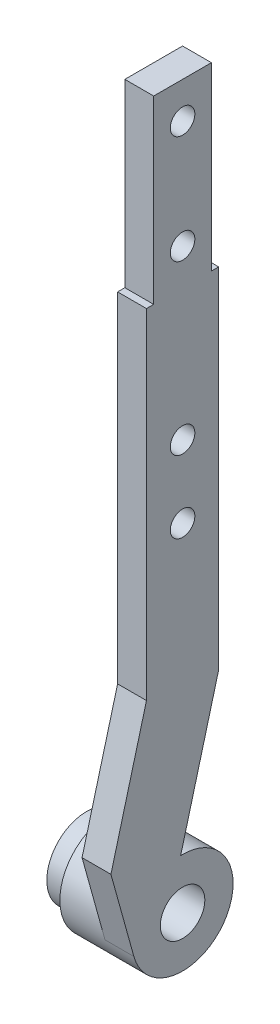
ISO-10303-21;
HEADER;
FILE_DESCRIPTION(('STEP AP214'),'2;1');
FILE_NAME('part.step','',(''),(''),'','','');
FILE_SCHEMA(('AUTOMOTIVE_DESIGN { 1 0 10303 214 1 1 1 1 }'));
ENDSEC;
DATA;
#1=APPLICATION_CONTEXT('core data for automotive mechanical design processes');
#2=APPLICATION_PROTOCOL_DEFINITION('international standard','automotive_design',2000,#1);
#3=PRODUCT_CONTEXT('',#1,'mechanical');
#4=PRODUCT('Part','Part','',(#3));
#5=PRODUCT_RELATED_PRODUCT_CATEGORY('part','',(#4));
#6=PRODUCT_DEFINITION_FORMATION('','',#4);
#7=PRODUCT_DEFINITION_CONTEXT('part definition',#1,'design');
#8=PRODUCT_DEFINITION('design','',#6,#7);
#9=PRODUCT_DEFINITION_SHAPE('','',#8);
#10=(LENGTH_UNIT() NAMED_UNIT(*) SI_UNIT(.MILLI.,.METRE.));
#11=(NAMED_UNIT(*) PLANE_ANGLE_UNIT() SI_UNIT($,.RADIAN.));
#12=(NAMED_UNIT(*) SI_UNIT($,.STERADIAN.) SOLID_ANGLE_UNIT());
#13=UNCERTAINTY_MEASURE_WITH_UNIT(LENGTH_MEASURE(1.E-05),#10,'distance_accuracy_value','');
#14=(GEOMETRIC_REPRESENTATION_CONTEXT(3) GLOBAL_UNCERTAINTY_ASSIGNED_CONTEXT((#13)) GLOBAL_UNIT_ASSIGNED_CONTEXT((#10,
#11,#12)) REPRESENTATION_CONTEXT('',''));
#15=CARTESIAN_POINT('',(0.,0.,0.));
#16=DIRECTION('',(0.,0.,1.));
#17=DIRECTION('',(1.,0.,0.));
#18=AXIS2_PLACEMENT_3D('',#15,#16,#17);
#19=CARTESIAN_POINT('',(-30.145,0.,0.));
#20=DIRECTION('',(1.,0.,0.));
#21=DIRECTION('',(0.,0.,1.));
#22=AXIS2_PLACEMENT_3D('',#19,#20,#21);
#23=CYLINDRICAL_SURFACE('',#22,7.);
#24=CARTESIAN_POINT('',(-30.145,0.,0.));
#25=DIRECTION('',(1.,0.,0.));
#26=DIRECTION('',(0.,0.,-1.));
#27=AXIS2_PLACEMENT_3D('',#24,#25,#26);
#28=CIRCLE('',#27,7.);
#29=CARTESIAN_POINT('',(-30.145,0.,-7.));
#30=VERTEX_POINT('',#29);
#31=EDGE_CURVE('E49',#30,#30,#28,.T.);
#32=ORIENTED_EDGE('',*,*,#31,.T.);
#33=EDGE_LOOP('',(#32));
#34=FACE_BOUND('',#33,.T.);
#35=DIRECTION('',(1.,0.,0.));
#36=VECTOR('',#35,1.);
#37=CARTESIAN_POINT('',(-24.145,6.99491771434268,0.266694899791794));
#38=LINE('',#37,#36);
#39=CARTESIAN_POINT('',(-24.145,6.99491771434268,0.266694899791794));
#40=VERTEX_POINT('',#39);
#41=CARTESIAN_POINT('',(-20.145,6.99491771434268,0.266694899791793));
#42=VERTEX_POINT('',#41);
#43=EDGE_CURVE('E139',#40,#42,#38,.T.);
#44=ORIENTED_EDGE('',*,*,#43,.T.);
#45=CARTESIAN_POINT('',(-20.145,0.,0.));
#46=DIRECTION('',(1.,0.,0.));
#47=DIRECTION('',(0.,0.,-1.));
#48=AXIS2_PLACEMENT_3D('',#45,#46,#47);
#49=CIRCLE('',#48,7.);
#50=CARTESIAN_POINT('',(-20.145,-1.87292477240286,6.74478708314204));
#51=VERTEX_POINT('',#50);
#52=EDGE_CURVE('E231',#51,#42,#49,.T.);
#53=ORIENTED_EDGE('',*,*,#52,.F.);
#54=DIRECTION('',(1.,0.,0.));
#55=VECTOR('',#54,1.);
#56=CARTESIAN_POINT('',(-24.145,-1.87292477240286,6.74478708314204));
#57=LINE('',#56,#55);
#58=CARTESIAN_POINT('',(-24.145,-1.87292477240286,6.74478708314204));
#59=VERTEX_POINT('',#58);
#60=EDGE_CURVE('E175',#59,#51,#57,.T.);
#61=ORIENTED_EDGE('',*,*,#60,.F.);
#62=CARTESIAN_POINT('',(-24.145,0.,0.));
#63=DIRECTION('',(1.,0.,0.));
#64=DIRECTION('',(0.,0.,-1.));
#65=AXIS2_PLACEMENT_3D('',#62,#63,#64);
#66=CIRCLE('',#65,7.);
#67=EDGE_CURVE('E145',#40,#59,#66,.T.);
#68=ORIENTED_EDGE('',*,*,#67,.F.);
#69=EDGE_LOOP('',(#44,#53,#61,#68));
#70=FACE_BOUND('',#69,.T.);
#71=ADVANCED_FACE('F41',(#34,#70),#23,.T.);
#72=CARTESIAN_POINT('',(-30.145,0.,0.));
#73=DIRECTION('',(1.,0.,0.));
#74=DIRECTION('',(0.,0.,1.));
#75=AXIS2_PLACEMENT_3D('',#72,#73,#74);
#76=CYLINDRICAL_SURFACE('',#75,3.0845);
#77=CARTESIAN_POINT('',(-20.145,0.,0.));
#78=DIRECTION('',(1.,0.,0.));
#79=DIRECTION('',(0.,0.,-1.));
#80=AXIS2_PLACEMENT_3D('',#77,#78,#79);
#81=CIRCLE('',#80,3.0845);
#82=CARTESIAN_POINT('',(-20.145,0.,-3.0845));
#83=VERTEX_POINT('',#82);
#84=EDGE_CURVE('E228',#83,#83,#81,.T.);
#85=ORIENTED_EDGE('',*,*,#84,.T.);
#86=EDGE_LOOP('',(#85));
#87=FACE_BOUND('',#86,.T.);
#88=CARTESIAN_POINT('',(-27.145,0.,0.));
#89=DIRECTION('',(1.,0.,0.));
#90=DIRECTION('',(0.,0.,-1.));
#91=AXIS2_PLACEMENT_3D('',#88,#89,#90);
#92=CIRCLE('',#91,3.0845);
#93=CARTESIAN_POINT('',(-27.145,0.,-3.0845));
#94=VERTEX_POINT('',#93);
#95=EDGE_CURVE('E225',#94,#94,#92,.T.);
#96=ORIENTED_EDGE('',*,*,#95,.F.);
#97=EDGE_LOOP('',(#96));
#98=FACE_BOUND('',#97,.T.);
#99=ADVANCED_FACE('F43',(#87,#98),#76,.F.);
#100=CARTESIAN_POINT('',(-30.145,0.,0.));
#101=DIRECTION('',(-1.,0.,0.));
#102=DIRECTION('',(0.,0.,-1.));
#103=AXIS2_PLACEMENT_3D('',#100,#101,#102);
#104=PLANE('',#103);
#105=CARTESIAN_POINT('',(-30.145,0.,0.));
#106=DIRECTION('',(1.,0.,0.));
#107=DIRECTION('',(0.,0.,-1.));
#108=AXIS2_PLACEMENT_3D('',#105,#106,#107);
#109=CIRCLE('',#108,5.49999999999996);
#110=CARTESIAN_POINT('',(-30.145,0.,-5.49999999999996));
#111=VERTEX_POINT('',#110);
#112=EDGE_CURVE('E548',#111,#111,#109,.T.);
#113=ORIENTED_EDGE('',*,*,#112,.T.);
#114=EDGE_LOOP('',(#113));
#115=FACE_BOUND('',#114,.T.);
#116=ORIENTED_EDGE('',*,*,#31,.F.);
#117=EDGE_LOOP('',(#116));
#118=FACE_BOUND('',#117,.T.);
#119=ADVANCED_FACE('F284',(#115,#118),#104,.T.);
#120=CARTESIAN_POINT('',(-20.145,0.,0.));
#121=DIRECTION('',(-1.,0.,0.));
#122=DIRECTION('',(0.,0.,-1.));
#123=AXIS2_PLACEMENT_3D('',#120,#121,#122);
#124=PLANE('',#123);
#125=CARTESIAN_POINT('',(-20.145,56.7479660865774,0.));
#126=DIRECTION('',(-1.,0.,0.));
#127=DIRECTION('',(0.,0.,1.));
#128=AXIS2_PLACEMENT_3D('',#125,#126,#127);
#129=CIRCLE('',#128,1.7);
#130=CARTESIAN_POINT('',(-20.145,56.7479660865774,1.7));
#131=VERTEX_POINT('',#130);
#132=EDGE_CURVE('E544',#131,#131,#129,.T.);
#133=ORIENTED_EDGE('',*,*,#132,.T.);
#134=EDGE_LOOP('',(#133));
#135=FACE_BOUND('',#134,.T.);
#136=CARTESIAN_POINT('',(-20.145,46.7479660865774,0.));
#137=DIRECTION('',(-1.,0.,0.));
#138=DIRECTION('',(0.,0.,1.));
#139=AXIS2_PLACEMENT_3D('',#136,#137,#138);
#140=CIRCLE('',#139,1.7);
#141=CARTESIAN_POINT('',(-20.145,46.7479660865774,1.7));
#142=VERTEX_POINT('',#141);
#143=EDGE_CURVE('E553',#142,#142,#140,.T.);
#144=ORIENTED_EDGE('',*,*,#143,.T.);
#145=EDGE_LOOP('',(#144));
#146=FACE_BOUND('',#145,.T.);
#147=ORIENTED_EDGE('',*,*,#84,.F.);
#148=EDGE_LOOP('',(#147));
#149=FACE_BOUND('',#148,.T.);
#150=ORIENTED_EDGE('',*,*,#52,.T.);
#151=DIRECTION('',(0.,0.965925826289068,-0.258819045102521));
#152=VECTOR('',#151,1.);
#153=CARTESIAN_POINT('',(-20.145,0.53524436311802,1.99755915762129));
#154=LINE('',#153,#152);
#155=CARTESIAN_POINT('',(-20.145,26.6504906683294,-4.99999999999999));
#156=VERTEX_POINT('',#155);
#157=EDGE_CURVE('E176',#42,#156,#154,.T.);
#158=ORIENTED_EDGE('',*,*,#157,.T.);
#159=DIRECTION('',(0.,1.,0.));
#160=VECTOR('',#159,1.);
#161=CARTESIAN_POINT('',(-20.145,0.,-4.99999999999999));
#162=LINE('',#161,#160);
#163=CARTESIAN_POINT('',(-20.145,75.,-4.99999999999999));
#164=VERTEX_POINT('',#163);
#165=EDGE_CURVE('E136',#156,#164,#162,.T.);
#166=ORIENTED_EDGE('',*,*,#165,.T.);
#167=DIRECTION('',(0.,0.,1.));
#168=VECTOR('',#167,1.);
#169=CARTESIAN_POINT('',(-20.145,75.,0.));
#170=LINE('',#169,#168);
#171=CARTESIAN_POINT('',(-20.145,75.,-4.));
#172=VERTEX_POINT('',#171);
#173=EDGE_CURVE('E180',#164,#172,#170,.T.);
#174=ORIENTED_EDGE('',*,*,#173,.T.);
#175=DIRECTION('',(0.,1.,0.));
#176=VECTOR('',#175,1.);
#177=CARTESIAN_POINT('',(-20.145,0.,-4.));
#178=LINE('',#177,#176);
#179=CARTESIAN_POINT('',(-20.145,100.,-4.));
#180=VERTEX_POINT('',#179);
#181=EDGE_CURVE('E183',#172,#180,#178,.T.);
#182=ORIENTED_EDGE('',*,*,#181,.T.);
#183=DIRECTION('',(0.,0.,1.));
#184=VECTOR('',#183,1.);
#185=CARTESIAN_POINT('',(-20.145,100.,0.));
#186=LINE('',#185,#184);
#187=CARTESIAN_POINT('',(-20.145,100.,4.00000000000001));
#188=VERTEX_POINT('',#187);
#189=EDGE_CURVE('E186',#180,#188,#186,.T.);
#190=ORIENTED_EDGE('',*,*,#189,.T.);
#191=DIRECTION('',(0.,1.,0.));
#192=VECTOR('',#191,1.);
#193=CARTESIAN_POINT('',(-20.145,0.,4.00000000000001));
#194=LINE('',#193,#192);
#195=CARTESIAN_POINT('',(-20.145,75.,4.00000000000001));
#196=VERTEX_POINT('',#195);
#197=EDGE_CURVE('E189',#196,#188,#194,.T.);
#198=ORIENTED_EDGE('',*,*,#197,.F.);
#199=DIRECTION('',(0.,0.,-1.));
#200=VECTOR('',#199,1.);
#201=CARTESIAN_POINT('',(-20.145,75.,0.));
#202=LINE('',#201,#200);
#203=CARTESIAN_POINT('',(-20.145,75.,5.));
#204=VERTEX_POINT('',#203);
#205=EDGE_CURVE('E192',#204,#196,#202,.T.);
#206=ORIENTED_EDGE('',*,*,#205,.F.);
#207=DIRECTION('',(0.,-1.,0.));
#208=VECTOR('',#207,1.);
#209=CARTESIAN_POINT('',(-20.145,0.,5.));
#210=LINE('',#209,#208);
#211=CARTESIAN_POINT('',(-20.145,27.9670156442034,5.));
#212=VERTEX_POINT('',#211);
#213=EDGE_CURVE('E195',#204,#212,#210,.T.);
#214=ORIENTED_EDGE('',*,*,#213,.T.);
#215=DIRECTION('',(0.,-0.965925826289068,0.258819045102521));
#216=VECTOR('',#215,1.);
#217=CARTESIAN_POINT('',(-20.145,3.12343481414323,11.656817420512));
#218=LINE('',#217,#216);
#219=CARTESIAN_POINT('',(-20.145,9.5831081653679,9.92595316268247));
#220=VERTEX_POINT('',#219);
#221=EDGE_CURVE('E198',#212,#220,#218,.T.);
#222=ORIENTED_EDGE('',*,*,#221,.T.);
#223=DIRECTION('',(0.,-0.963541011877434,-0.267560681771837));
#224=VECTOR('',#223,1.);
#225=CARTESIAN_POINT('',(-20.145,-1.87292477240286,6.74478708314204));
#226=LINE('',#225,#224);
#227=EDGE_CURVE('E201',#220,#51,#226,.T.);
#228=ORIENTED_EDGE('',*,*,#227,.T.);
#229=EDGE_LOOP('',(#150,#158,#166,#174,#182,#190,#198,#206,#214,#222,#228));
#230=FACE_BOUND('',#229,.T.);
#231=CARTESIAN_POINT('',(-20.145,80.,0.));
#232=DIRECTION('',(1.,0.,0.));
#233=DIRECTION('',(0.,0.,-1.));
#234=AXIS2_PLACEMENT_3D('',#231,#232,#233);
#235=CIRCLE('',#234,1.70000000000001);
#236=CARTESIAN_POINT('',(-20.145,80.,-1.7));
#237=VERTEX_POINT('',#236);
#238=EDGE_CURVE('E203',#237,#237,#235,.T.);
#239=ORIENTED_EDGE('',*,*,#238,.F.);
#240=EDGE_LOOP('',(#239));
#241=FACE_BOUND('',#240,.T.);
#242=CARTESIAN_POINT('',(-20.145,95.,0.));
#243=DIRECTION('',(1.,0.,0.));
#244=DIRECTION('',(0.,0.,-1.));
#245=AXIS2_PLACEMENT_3D('',#242,#243,#244);
#246=CIRCLE('',#245,1.70000000000001);
#247=CARTESIAN_POINT('',(-20.145,95.,-1.7));
#248=VERTEX_POINT('',#247);
#249=EDGE_CURVE('E147',#248,#248,#246,.T.);
#250=ORIENTED_EDGE('',*,*,#249,.F.);
#251=EDGE_LOOP('',(#250));
#252=FACE_BOUND('',#251,.T.);
#253=ADVANCED_FACE('F236',(#135,#146,#149,#230,#241,#252),#124,.F.);
#254=CARTESIAN_POINT('',(-27.145,0.,0.));
#255=DIRECTION('',(-1.,0.,0.));
#256=DIRECTION('',(0.,0.,-1.));
#257=AXIS2_PLACEMENT_3D('',#254,#255,#256);
#258=PLANE('',#257);
#259=ORIENTED_EDGE('',*,*,#95,.T.);
#260=EDGE_LOOP('',(#259));
#261=FACE_BOUND('',#260,.T.);
#262=ADVANCED_FACE('F289',(#261),#258,.F.);
#263=CARTESIAN_POINT('',(-24.145,0.53524436311802,1.99755915762129));
#264=DIRECTION('',(0.,0.258819045102521,0.965925826289068));
#265=DIRECTION('',(0.,0.965925826289068,-0.258819045102521));
#266=AXIS2_PLACEMENT_3D('',#263,#264,#265);
#267=PLANE('',#266);
#268=ORIENTED_EDGE('',*,*,#157,.F.);
#269=ORIENTED_EDGE('',*,*,#43,.F.);
#270=DIRECTION('',(0.,0.965925826289068,-0.258819045102521));
#271=VECTOR('',#270,1.);
#272=CARTESIAN_POINT('',(-24.145,0.53524436311802,1.99755915762129));
#273=LINE('',#272,#271);
#274=CARTESIAN_POINT('',(-24.145,26.6504906683294,-4.99999999999999));
#275=VERTEX_POINT('',#274);
#276=EDGE_CURVE('E63',#40,#275,#273,.T.);
#277=ORIENTED_EDGE('',*,*,#276,.T.);
#278=DIRECTION('',(1.,0.,0.));
#279=VECTOR('',#278,1.);
#280=CARTESIAN_POINT('',(-24.145,26.6504906683294,-4.99999999999999));
#281=LINE('',#280,#279);
#282=EDGE_CURVE('E133',#275,#156,#281,.T.);
#283=ORIENTED_EDGE('',*,*,#282,.T.);
#284=EDGE_LOOP('',(#268,#269,#277,#283));
#285=FACE_BOUND('',#284,.T.);
#286=ADVANCED_FACE('F143',(#285),#267,.F.);
#287=CARTESIAN_POINT('',(-24.145,0.,-4.99999999999999));
#288=DIRECTION('',(0.,0.,1.));
#289=DIRECTION('',(-1.,0.,0.));
#290=AXIS2_PLACEMENT_3D('',#287,#288,#289);
#291=PLANE('',#290);
#292=ORIENTED_EDGE('',*,*,#165,.F.);
#293=ORIENTED_EDGE('',*,*,#282,.F.);
#294=DIRECTION('',(0.,1.,0.));
#295=VECTOR('',#294,1.);
#296=CARTESIAN_POINT('',(-24.145,0.,-4.99999999999999));
#297=LINE('',#296,#295);
#298=CARTESIAN_POINT('',(-24.145,75.,-4.99999999999999));
#299=VERTEX_POINT('',#298);
#300=EDGE_CURVE('E123',#275,#299,#297,.T.);
#301=ORIENTED_EDGE('',*,*,#300,.T.);
#302=DIRECTION('',(1.,0.,0.));
#303=VECTOR('',#302,1.);
#304=CARTESIAN_POINT('',(-24.145,75.,-4.99999999999999));
#305=LINE('',#304,#303);
#306=EDGE_CURVE('E140',#299,#164,#305,.T.);
#307=ORIENTED_EDGE('',*,*,#306,.T.);
#308=EDGE_LOOP('',(#292,#293,#301,#307));
#309=FACE_BOUND('',#308,.T.);
#310=ADVANCED_FACE('F134',(#309),#291,.F.);
#311=CARTESIAN_POINT('',(-24.145,75.,0.));
#312=DIRECTION('',(0.,-1.,0.));
#313=DIRECTION('',(1.,0.,0.));
#314=AXIS2_PLACEMENT_3D('',#311,#312,#313);
#315=PLANE('',#314);
#316=ORIENTED_EDGE('',*,*,#173,.F.);
#317=ORIENTED_EDGE('',*,*,#306,.F.);
#318=DIRECTION('',(0.,0.,1.));
#319=VECTOR('',#318,1.);
#320=CARTESIAN_POINT('',(-24.145,75.,0.));
#321=LINE('',#320,#319);
#322=CARTESIAN_POINT('',(-24.145,75.,-4.));
#323=VERTEX_POINT('',#322);
#324=EDGE_CURVE('E128',#299,#323,#321,.T.);
#325=ORIENTED_EDGE('',*,*,#324,.T.);
#326=DIRECTION('',(1.,0.,0.));
#327=VECTOR('',#326,1.);
#328=CARTESIAN_POINT('',(-24.145,75.,-4.));
#329=LINE('',#328,#327);
#330=EDGE_CURVE('E221',#323,#172,#329,.T.);
#331=ORIENTED_EDGE('',*,*,#330,.T.);
#332=EDGE_LOOP('',(#316,#317,#325,#331));
#333=FACE_BOUND('',#332,.T.);
#334=ADVANCED_FACE('F270',(#333),#315,.F.);
#335=CARTESIAN_POINT('',(-24.145,0.,-4.));
#336=DIRECTION('',(0.,0.,1.));
#337=DIRECTION('',(-1.,0.,0.));
#338=AXIS2_PLACEMENT_3D('',#335,#336,#337);
#339=PLANE('',#338);
#340=ORIENTED_EDGE('',*,*,#181,.F.);
#341=ORIENTED_EDGE('',*,*,#330,.F.);
#342=DIRECTION('',(0.,1.,0.));
#343=VECTOR('',#342,1.);
#344=CARTESIAN_POINT('',(-24.145,0.,-4.));
#345=LINE('',#344,#343);
#346=CARTESIAN_POINT('',(-24.145,100.,-4.));
#347=VERTEX_POINT('',#346);
#348=EDGE_CURVE('E152',#323,#347,#345,.T.);
#349=ORIENTED_EDGE('',*,*,#348,.T.);
#350=DIRECTION('',(1.,0.,0.));
#351=VECTOR('',#350,1.);
#352=CARTESIAN_POINT('',(-24.145,100.,-4.));
#353=LINE('',#352,#351);
#354=EDGE_CURVE('E219',#347,#180,#353,.T.);
#355=ORIENTED_EDGE('',*,*,#354,.T.);
#356=EDGE_LOOP('',(#340,#341,#349,#355));
#357=FACE_BOUND('',#356,.T.);
#358=ADVANCED_FACE('F267',(#357),#339,.F.);
#359=CARTESIAN_POINT('',(-24.145,100.,0.));
#360=DIRECTION('',(0.,-1.,0.));
#361=DIRECTION('',(1.,0.,0.));
#362=AXIS2_PLACEMENT_3D('',#359,#360,#361);
#363=PLANE('',#362);
#364=ORIENTED_EDGE('',*,*,#189,.F.);
#365=ORIENTED_EDGE('',*,*,#354,.F.);
#366=DIRECTION('',(0.,0.,1.));
#367=VECTOR('',#366,1.);
#368=CARTESIAN_POINT('',(-24.145,100.,0.));
#369=LINE('',#368,#367);
#370=CARTESIAN_POINT('',(-24.145,100.,4.00000000000001));
#371=VERTEX_POINT('',#370);
#372=EDGE_CURVE('E155',#347,#371,#369,.T.);
#373=ORIENTED_EDGE('',*,*,#372,.T.);
#374=DIRECTION('',(1.,0.,0.));
#375=VECTOR('',#374,1.);
#376=CARTESIAN_POINT('',(-24.145,100.,4.00000000000001));
#377=LINE('',#376,#375);
#378=EDGE_CURVE('E217',#371,#188,#377,.T.);
#379=ORIENTED_EDGE('',*,*,#378,.T.);
#380=EDGE_LOOP('',(#364,#365,#373,#379));
#381=FACE_BOUND('',#380,.T.);
#382=ADVANCED_FACE('F263',(#381),#363,.F.);
#383=CARTESIAN_POINT('',(-24.145,0.,4.00000000000001));
#384=DIRECTION('',(0.,0.,1.));
#385=DIRECTION('',(-1.,0.,0.));
#386=AXIS2_PLACEMENT_3D('',#383,#384,#385);
#387=PLANE('',#386);
#388=ORIENTED_EDGE('',*,*,#197,.T.);
#389=ORIENTED_EDGE('',*,*,#378,.F.);
#390=DIRECTION('',(0.,1.,0.));
#391=VECTOR('',#390,1.);
#392=CARTESIAN_POINT('',(-24.145,0.,4.00000000000001));
#393=LINE('',#392,#391);
#394=CARTESIAN_POINT('',(-24.145,75.,4.00000000000001));
#395=VERTEX_POINT('',#394);
#396=EDGE_CURVE('E158',#395,#371,#393,.T.);
#397=ORIENTED_EDGE('',*,*,#396,.F.);
#398=DIRECTION('',(1.,0.,0.));
#399=VECTOR('',#398,1.);
#400=CARTESIAN_POINT('',(-24.145,75.,4.00000000000001));
#401=LINE('',#400,#399);
#402=EDGE_CURVE('E215',#395,#196,#401,.T.);
#403=ORIENTED_EDGE('',*,*,#402,.T.);
#404=EDGE_LOOP('',(#388,#389,#397,#403));
#405=FACE_BOUND('',#404,.T.);
#406=ADVANCED_FACE('F259',(#405),#387,.T.);
#407=CARTESIAN_POINT('',(-24.145,75.,0.));
#408=DIRECTION('',(0.,1.,0.));
#409=DIRECTION('',(-1.,0.,0.));
#410=AXIS2_PLACEMENT_3D('',#407,#408,#409);
#411=PLANE('',#410);
#412=ORIENTED_EDGE('',*,*,#205,.T.);
#413=ORIENTED_EDGE('',*,*,#402,.F.);
#414=DIRECTION('',(0.,0.,-1.));
#415=VECTOR('',#414,1.);
#416=CARTESIAN_POINT('',(-24.145,75.,0.));
#417=LINE('',#416,#415);
#418=CARTESIAN_POINT('',(-24.145,75.,5.));
#419=VERTEX_POINT('',#418);
#420=EDGE_CURVE('E160',#419,#395,#417,.T.);
#421=ORIENTED_EDGE('',*,*,#420,.F.);
#422=DIRECTION('',(1.,0.,0.));
#423=VECTOR('',#422,1.);
#424=CARTESIAN_POINT('',(-24.145,75.,5.));
#425=LINE('',#424,#423);
#426=EDGE_CURVE('E213',#419,#204,#425,.T.);
#427=ORIENTED_EDGE('',*,*,#426,.T.);
#428=EDGE_LOOP('',(#412,#413,#421,#427));
#429=FACE_BOUND('',#428,.T.);
#430=ADVANCED_FACE('F255',(#429),#411,.T.);
#431=CARTESIAN_POINT('',(-24.145,0.,5.));
#432=DIRECTION('',(0.,0.,-1.));
#433=DIRECTION('',(1.,0.,0.));
#434=AXIS2_PLACEMENT_3D('',#431,#432,#433);
#435=PLANE('',#434);
#436=ORIENTED_EDGE('',*,*,#213,.F.);
#437=ORIENTED_EDGE('',*,*,#426,.F.);
#438=DIRECTION('',(0.,-1.,0.));
#439=VECTOR('',#438,1.);
#440=CARTESIAN_POINT('',(-24.145,0.,5.));
#441=LINE('',#440,#439);
#442=CARTESIAN_POINT('',(-24.145,27.9670156442034,5.));
#443=VERTEX_POINT('',#442);
#444=EDGE_CURVE('E162',#419,#443,#441,.T.);
#445=ORIENTED_EDGE('',*,*,#444,.T.);
#446=DIRECTION('',(1.,0.,0.));
#447=VECTOR('',#446,1.);
#448=CARTESIAN_POINT('',(-24.145,27.9670156442034,5.));
#449=LINE('',#448,#447);
#450=EDGE_CURVE('E211',#443,#212,#449,.T.);
#451=ORIENTED_EDGE('',*,*,#450,.T.);
#452=EDGE_LOOP('',(#436,#437,#445,#451));
#453=FACE_BOUND('',#452,.T.);
#454=ADVANCED_FACE('F249',(#453),#435,.F.);
#455=CARTESIAN_POINT('',(-24.145,3.12343481414323,11.656817420512));
#456=DIRECTION('',(0.,-0.258819045102521,-0.965925826289068));
#457=DIRECTION('',(0.,-0.965925826289068,0.258819045102521));
#458=AXIS2_PLACEMENT_3D('',#455,#456,#457);
#459=PLANE('',#458);
#460=ORIENTED_EDGE('',*,*,#221,.F.);
#461=ORIENTED_EDGE('',*,*,#450,.F.);
#462=DIRECTION('',(0.,-0.965925826289068,0.258819045102521));
#463=VECTOR('',#462,1.);
#464=CARTESIAN_POINT('',(-24.145,3.12343481414323,11.656817420512));
#465=LINE('',#464,#463);
#466=CARTESIAN_POINT('',(-24.145,9.5831081653679,9.92595316268247));
#467=VERTEX_POINT('',#466);
#468=EDGE_CURVE('E165',#443,#467,#465,.T.);
#469=ORIENTED_EDGE('',*,*,#468,.T.);
#470=DIRECTION('',(1.,0.,0.));
#471=VECTOR('',#470,1.);
#472=CARTESIAN_POINT('',(-24.145,9.5831081653679,9.92595316268247));
#473=LINE('',#472,#471);
#474=EDGE_CURVE('E209',#467,#220,#473,.T.);
#475=ORIENTED_EDGE('',*,*,#474,.T.);
#476=EDGE_LOOP('',(#460,#461,#469,#475));
#477=FACE_BOUND('',#476,.T.);
#478=ADVANCED_FACE('F245',(#477),#459,.F.);
#479=CARTESIAN_POINT('',(-24.145,80.,0.));
#480=DIRECTION('',(1.,0.,0.));
#481=DIRECTION('',(0.,0.,1.));
#482=AXIS2_PLACEMENT_3D('',#479,#480,#481);
#483=CYLINDRICAL_SURFACE('',#482,1.70000000000001);
#484=CARTESIAN_POINT('',(-24.145,80.,0.));
#485=DIRECTION('',(1.,0.,0.));
#486=DIRECTION('',(0.,0.,-1.));
#487=AXIS2_PLACEMENT_3D('',#484,#485,#486);
#488=CIRCLE('',#487,1.70000000000001);
#489=CARTESIAN_POINT('',(-24.145,80.,-1.7));
#490=VERTEX_POINT('',#489);
#491=EDGE_CURVE('E169',#490,#490,#488,.T.);
#492=ORIENTED_EDGE('',*,*,#491,.F.);
#493=EDGE_LOOP('',(#492));
#494=FACE_BOUND('',#493,.T.);
#495=ORIENTED_EDGE('',*,*,#238,.T.);
#496=EDGE_LOOP('',(#495));
#497=FACE_BOUND('',#496,.T.);
#498=ADVANCED_FACE('F365',(#494,#497),#483,.F.);
#499=CARTESIAN_POINT('',(-24.145,-1.87292477240286,6.74478708314204));
#500=DIRECTION('',(0.,0.267560681771837,-0.963541011877434));
#501=DIRECTION('',(0.,-0.963541011877434,-0.267560681771837));
#502=AXIS2_PLACEMENT_3D('',#499,#500,#501);
#503=PLANE('',#502);
#504=ORIENTED_EDGE('',*,*,#227,.F.);
#505=ORIENTED_EDGE('',*,*,#474,.F.);
#506=DIRECTION('',(0.,-0.963541011877434,-0.267560681771837));
#507=VECTOR('',#506,1.);
#508=CARTESIAN_POINT('',(-24.145,-1.87292477240286,6.74478708314204));
#509=LINE('',#508,#507);
#510=EDGE_CURVE('E56',#467,#59,#509,.T.);
#511=ORIENTED_EDGE('',*,*,#510,.T.);
#512=ORIENTED_EDGE('',*,*,#60,.T.);
#513=EDGE_LOOP('',(#504,#505,#511,#512));
#514=FACE_BOUND('',#513,.T.);
#515=ADVANCED_FACE('F242',(#514),#503,.F.);
#516=CARTESIAN_POINT('',(-24.145,95.,0.));
#517=DIRECTION('',(1.,0.,0.));
#518=DIRECTION('',(0.,0.,1.));
#519=AXIS2_PLACEMENT_3D('',#516,#517,#518);
#520=CYLINDRICAL_SURFACE('',#519,1.70000000000001);
#521=CARTESIAN_POINT('',(-24.145,95.,0.));
#522=DIRECTION('',(1.,0.,0.));
#523=DIRECTION('',(0.,0.,-1.));
#524=AXIS2_PLACEMENT_3D('',#521,#522,#523);
#525=CIRCLE('',#524,1.70000000000001);
#526=CARTESIAN_POINT('',(-24.145,95.,-1.7));
#527=VERTEX_POINT('',#526);
#528=EDGE_CURVE('E172',#527,#527,#525,.T.);
#529=ORIENTED_EDGE('',*,*,#528,.F.);
#530=EDGE_LOOP('',(#529));
#531=FACE_BOUND('',#530,.T.);
#532=ORIENTED_EDGE('',*,*,#249,.T.);
#533=EDGE_LOOP('',(#532));
#534=FACE_BOUND('',#533,.T.);
#535=ADVANCED_FACE('F385',(#531,#534),#520,.F.);
#536=CARTESIAN_POINT('',(-24.145,0.,0.));
#537=DIRECTION('',(-1.,0.,0.));
#538=DIRECTION('',(0.,0.,-1.));
#539=AXIS2_PLACEMENT_3D('',#536,#537,#538);
#540=PLANE('',#539);
#541=CARTESIAN_POINT('',(-24.145,56.7479660865774,0.));
#542=DIRECTION('',(1.,0.,0.));
#543=DIRECTION('',(0.,0.,-1.));
#544=AXIS2_PLACEMENT_3D('',#541,#542,#543);
#545=CIRCLE('',#544,1.7);
#546=CARTESIAN_POINT('',(-24.145,56.7479660865774,-1.7));
#547=VERTEX_POINT('',#546);
#548=EDGE_CURVE('E547',#547,#547,#545,.F.);
#549=ORIENTED_EDGE('',*,*,#548,.F.);
#550=EDGE_LOOP('',(#549));
#551=FACE_BOUND('',#550,.T.);
#552=CARTESIAN_POINT('',(-24.145,46.7479660865774,0.));
#553=DIRECTION('',(1.,0.,0.));
#554=DIRECTION('',(0.,0.,-1.));
#555=AXIS2_PLACEMENT_3D('',#552,#553,#554);
#556=CIRCLE('',#555,1.7);
#557=CARTESIAN_POINT('',(-24.145,46.7479660865774,-1.69999999999999));
#558=VERTEX_POINT('',#557);
#559=EDGE_CURVE('E556',#558,#558,#556,.F.);
#560=ORIENTED_EDGE('',*,*,#559,.F.);
#561=EDGE_LOOP('',(#560));
#562=FACE_BOUND('',#561,.T.);
#563=ORIENTED_EDGE('',*,*,#67,.T.);
#564=ORIENTED_EDGE('',*,*,#510,.F.);
#565=ORIENTED_EDGE('',*,*,#468,.F.);
#566=ORIENTED_EDGE('',*,*,#444,.F.);
#567=ORIENTED_EDGE('',*,*,#420,.T.);
#568=ORIENTED_EDGE('',*,*,#396,.T.);
#569=ORIENTED_EDGE('',*,*,#372,.F.);
#570=ORIENTED_EDGE('',*,*,#348,.F.);
#571=ORIENTED_EDGE('',*,*,#324,.F.);
#572=ORIENTED_EDGE('',*,*,#300,.F.);
#573=ORIENTED_EDGE('',*,*,#276,.F.);
#574=EDGE_LOOP('',(#563,#564,#565,#566,#567,#568,#569,#570,#571,#572,#573));
#575=FACE_BOUND('',#574,.T.);
#576=ORIENTED_EDGE('',*,*,#491,.T.);
#577=EDGE_LOOP('',(#576));
#578=FACE_BOUND('',#577,.T.);
#579=ORIENTED_EDGE('',*,*,#528,.T.);
#580=EDGE_LOOP('',(#579));
#581=FACE_BOUND('',#580,.T.);
#582=ADVANCED_FACE('F125',(#551,#562,#575,#578,#581),#540,.T.);
#583=CARTESIAN_POINT('',(-49.0063491861039,0.,0.));
#584=DIRECTION('',(1.,0.,0.));
#585=DIRECTION('',(0.,0.,1.));
#586=AXIS2_PLACEMENT_3D('',#583,#584,#585);
#587=CYLINDRICAL_SURFACE('',#586,5.49999999999996);
#588=ORIENTED_EDGE('',*,*,#112,.F.);
#589=EDGE_LOOP('',(#588));
#590=FACE_BOUND('',#589,.T.);
#591=CARTESIAN_POINT('',(-33.45,0.,0.));
#592=DIRECTION('',(1.,0.,0.));
#593=DIRECTION('',(0.,0.,-1.));
#594=AXIS2_PLACEMENT_3D('',#591,#592,#593);
#595=CIRCLE('',#594,5.49999999999996);
#596=CARTESIAN_POINT('',(-33.45,0.,-5.49999999999996));
#597=VERTEX_POINT('',#596);
#598=EDGE_CURVE('E178',#597,#597,#595,.T.);
#599=ORIENTED_EDGE('',*,*,#598,.T.);
#600=EDGE_LOOP('',(#599));
#601=FACE_BOUND('',#600,.T.);
#602=ADVANCED_FACE('F405',(#590,#601),#587,.T.);
#603=CARTESIAN_POINT('',(-49.0063491861039,0.,0.));
#604=DIRECTION('',(1.,0.,0.));
#605=DIRECTION('',(0.,0.,1.));
#606=AXIS2_PLACEMENT_3D('',#603,#604,#605);
#607=CYLINDRICAL_SURFACE('',#606,3.49999999999996);
#608=CARTESIAN_POINT('',(-30.145,0.,0.));
#609=DIRECTION('',(1.,0.,0.));
#610=DIRECTION('',(0.,0.,-1.));
#611=AXIS2_PLACEMENT_3D('',#608,#609,#610);
#612=CIRCLE('',#611,3.49999999999996);
#613=CARTESIAN_POINT('',(-30.145,0.,-3.49999999999996));
#614=VERTEX_POINT('',#613);
#615=EDGE_CURVE('E11',#614,#614,#612,.F.);
#616=ORIENTED_EDGE('',*,*,#615,.F.);
#617=EDGE_LOOP('',(#616));
#618=FACE_BOUND('',#617,.T.);
#619=CARTESIAN_POINT('',(-33.45,0.,0.));
#620=DIRECTION('',(1.,0.,0.));
#621=DIRECTION('',(0.,0.,-1.));
#622=AXIS2_PLACEMENT_3D('',#619,#620,#621);
#623=CIRCLE('',#622,3.49999999999996);
#624=CARTESIAN_POINT('',(-33.45,0.,-3.49999999999996));
#625=VERTEX_POINT('',#624);
#626=EDGE_CURVE('E551',#625,#625,#623,.T.);
#627=ORIENTED_EDGE('',*,*,#626,.F.);
#628=EDGE_LOOP('',(#627));
#629=FACE_BOUND('',#628,.T.);
#630=ADVANCED_FACE('F416',(#618,#629),#607,.F.);
#631=CARTESIAN_POINT('',(-33.45,0.,0.));
#632=DIRECTION('',(-1.,0.,0.));
#633=DIRECTION('',(0.,0.965925826289068,-0.258819045102521));
#634=AXIS2_PLACEMENT_3D('',#631,#632,#633);
#635=PLANE('',#634);
#636=ORIENTED_EDGE('',*,*,#626,.T.);
#637=EDGE_LOOP('',(#636));
#638=FACE_BOUND('',#637,.T.);
#639=ORIENTED_EDGE('',*,*,#598,.F.);
#640=EDGE_LOOP('',(#639));
#641=FACE_BOUND('',#640,.T.);
#642=ADVANCED_FACE('F427',(#638,#641),#635,.T.);
#643=ORIENTED_EDGE('',*,*,#615,.T.);
#644=EDGE_LOOP('',(#643));
#645=FACE_BOUND('',#644,.T.);
#646=ADVANCED_FACE('F294',(#645),#104,.T.);
#647=CARTESIAN_POINT('',(-28.9533261120685,46.7479660865774,0.));
#648=DIRECTION('',(1.,0.,0.));
#649=DIRECTION('',(0.,0.,1.));
#650=AXIS2_PLACEMENT_3D('',#647,#648,#649);
#651=CYLINDRICAL_SURFACE('',#650,1.7);
#652=ORIENTED_EDGE('',*,*,#143,.F.);
#653=EDGE_LOOP('',(#652));
#654=FACE_BOUND('',#653,.T.);
#655=ORIENTED_EDGE('',*,*,#559,.T.);
#656=EDGE_LOOP('',(#655));
#657=FACE_BOUND('',#656,.T.);
#658=ADVANCED_FACE('F449',(#654,#657),#651,.F.);
#659=CARTESIAN_POINT('',(-28.9533261120685,56.7479660865774,0.));
#660=DIRECTION('',(1.,0.,0.));
#661=DIRECTION('',(0.,0.,1.));
#662=AXIS2_PLACEMENT_3D('',#659,#660,#661);
#663=CYLINDRICAL_SURFACE('',#662,1.7);
#664=ORIENTED_EDGE('',*,*,#132,.F.);
#665=EDGE_LOOP('',(#664));
#666=FACE_BOUND('',#665,.T.);
#667=ORIENTED_EDGE('',*,*,#548,.T.);
#668=EDGE_LOOP('',(#667));
#669=FACE_BOUND('',#668,.T.);
#670=ADVANCED_FACE('F458',(#666,#669),#663,.F.);
#671=CLOSED_SHELL('',(#71,#99,#119,#253,#262,#286,#310,#334,#358,#382,#406,#430,#454,#478,#498,
#515,#535,#582,#602,#630,#642,#646,#658,#670));
#672=MANIFOLD_SOLID_BREP('B2',#671);
#673=ADVANCED_BREP_SHAPE_REPRESENTATION('',(#18,#672),#14);
#674=SHAPE_DEFINITION_REPRESENTATION(#9,#673);
ENDSEC;
END-ISO-10303-21;
